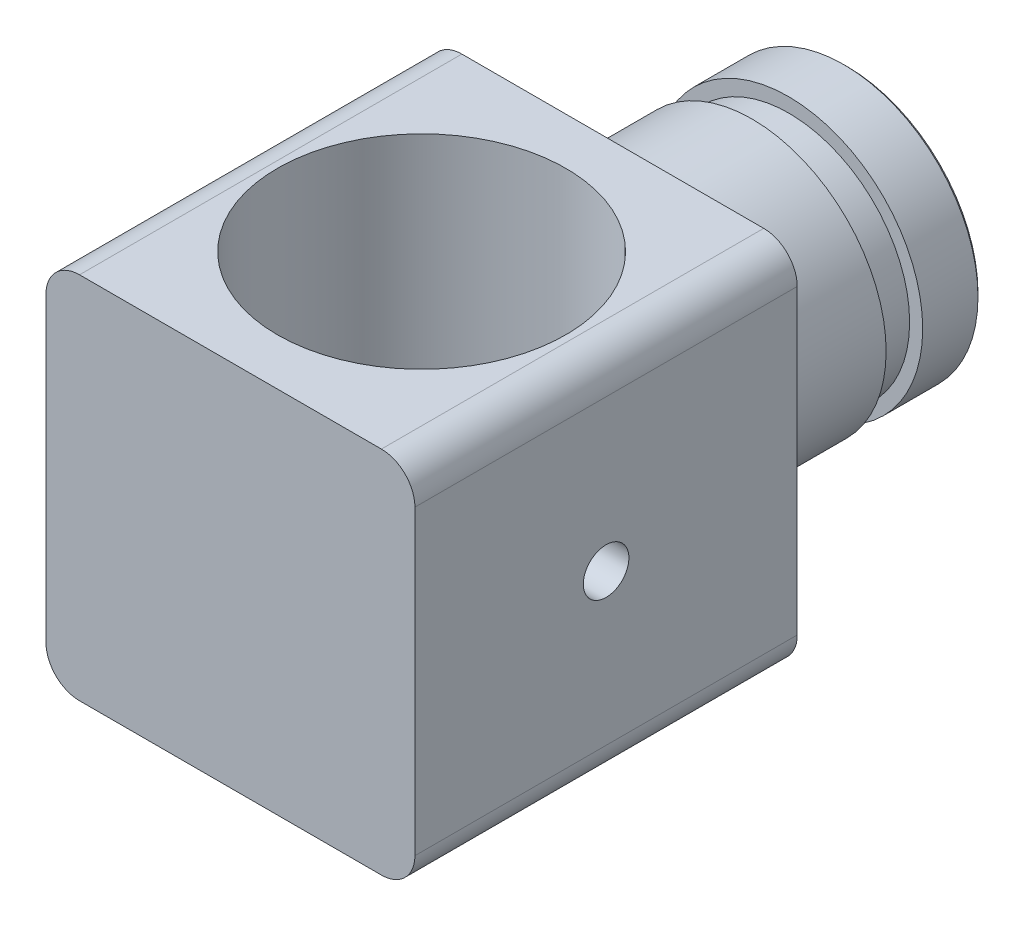
ISO-10303-21;
HEADER;
FILE_DESCRIPTION(('STEP AP214'),'2;1');
FILE_NAME('part.step','',(''),(''),'','','');
FILE_SCHEMA(('AUTOMOTIVE_DESIGN { 1 0 10303 214 1 1 1 1 }'));
ENDSEC;
DATA;
#1=APPLICATION_CONTEXT('core data for automotive mechanical design processes');
#2=APPLICATION_PROTOCOL_DEFINITION('international standard','automotive_design',2000,#1);
#3=PRODUCT_CONTEXT('',#1,'mechanical');
#4=PRODUCT('Part','Part','',(#3));
#5=PRODUCT_RELATED_PRODUCT_CATEGORY('part','',(#4));
#6=PRODUCT_DEFINITION_FORMATION('','',#4);
#7=PRODUCT_DEFINITION_CONTEXT('part definition',#1,'design');
#8=PRODUCT_DEFINITION('design','',#6,#7);
#9=PRODUCT_DEFINITION_SHAPE('','',#8);
#10=(LENGTH_UNIT() NAMED_UNIT(*) SI_UNIT(.MILLI.,.METRE.));
#11=(NAMED_UNIT(*) PLANE_ANGLE_UNIT() SI_UNIT($,.RADIAN.));
#12=(NAMED_UNIT(*) SI_UNIT($,.STERADIAN.) SOLID_ANGLE_UNIT());
#13=UNCERTAINTY_MEASURE_WITH_UNIT(LENGTH_MEASURE(1.E-05),#10,'distance_accuracy_value','');
#14=(GEOMETRIC_REPRESENTATION_CONTEXT(3) GLOBAL_UNCERTAINTY_ASSIGNED_CONTEXT((#13)) GLOBAL_UNIT_ASSIGNED_CONTEXT((#10,
#11,#12)) REPRESENTATION_CONTEXT('',''));
#15=CARTESIAN_POINT('',(0.,0.,0.));
#16=DIRECTION('',(0.,0.,1.));
#17=DIRECTION('',(1.,0.,0.));
#18=AXIS2_PLACEMENT_3D('',#15,#16,#17);
#19=CARTESIAN_POINT('',(27.5,27.5,-37.3403429036413));
#20=DIRECTION('',(0.,0.,1.));
#21=DIRECTION('',(1.,0.,0.));
#22=AXIS2_PLACEMENT_3D('',#19,#20,#21);
#23=PLANE('',#22);
#24=CARTESIAN_POINT('',(27.4461079792746,27.6137274611399,-37.3403429036413));
#25=DIRECTION('',(0.,0.,1.));
#26=DIRECTION('',(1.,0.,0.));
#27=AXIS2_PLACEMENT_3D('',#24,#25,#26);
#28=CIRCLE('',#27,19.5);
#29=CARTESIAN_POINT('',(46.9461079792746,27.6137274611399,-37.3403429036413));
#30=VERTEX_POINT('',#29);
#31=EDGE_CURVE('E12',#30,#30,#28,.F.);
#32=ORIENTED_EDGE('',*,*,#31,.T.);
#33=EDGE_LOOP('',(#32));
#34=FACE_BOUND('',#33,.T.);
#35=ADVANCED_FACE('F45',(#34),#23,.F.);
#36=CARTESIAN_POINT('',(27.4461079792746,27.6137274611399,-32.6853429036413));
#37=DIRECTION('',(0.,0.,-1.));
#38=DIRECTION('',(-1.,0.,0.));
#39=AXIS2_PLACEMENT_3D('',#36,#37,#38);
#40=CYLINDRICAL_SURFACE('',#39,20.);
#41=CARTESIAN_POINT('',(27.4461079792746,27.6137274611399,-36.8403429036413));
#42=DIRECTION('',(0.,0.,1.));
#43=DIRECTION('',(1.,0.,0.));
#44=AXIS2_PLACEMENT_3D('',#41,#42,#43);
#45=CIRCLE('',#44,20.);
#46=CARTESIAN_POINT('',(47.4461079792746,27.6137274611399,-36.8403429036413));
#47=VERTEX_POINT('',#46);
#48=EDGE_CURVE('E55',#47,#47,#45,.T.);
#49=ORIENTED_EDGE('',*,*,#48,.T.);
#50=EDGE_LOOP('',(#49));
#51=FACE_BOUND('',#50,.T.);
#52=CARTESIAN_POINT('',(27.4461079792746,27.6137274611399,-28.5953429036413));
#53=DIRECTION('',(0.,0.,1.));
#54=DIRECTION('',(1.,0.,0.));
#55=AXIS2_PLACEMENT_3D('',#52,#53,#54);
#56=CIRCLE('',#55,20.);
#57=CARTESIAN_POINT('',(47.4461079792746,27.6137274611399,-28.5953429036413));
#58=VERTEX_POINT('',#57);
#59=EDGE_CURVE('E158',#58,#58,#56,.T.);
#60=ORIENTED_EDGE('',*,*,#59,.F.);
#61=EDGE_LOOP('',(#60));
#62=FACE_BOUND('',#61,.T.);
#63=ADVANCED_FACE('F196',(#51,#62),#40,.T.);
#64=CARTESIAN_POINT('',(27.4461079792746,27.6137274611399,-28.5953429036413));
#65=DIRECTION('',(0.,0.,1.));
#66=DIRECTION('',(1.,0.,0.));
#67=AXIS2_PLACEMENT_3D('',#64,#65,#66);
#68=PLANE('',#67);
#69=ORIENTED_EDGE('',*,*,#59,.T.);
#70=EDGE_LOOP('',(#69));
#71=FACE_BOUND('',#70,.T.);
#72=CARTESIAN_POINT('',(27.5,27.5,-28.5953429036413));
#73=DIRECTION('',(0.,0.,1.));
#74=DIRECTION('',(1.,0.,0.));
#75=AXIS2_PLACEMENT_3D('',#72,#73,#74);
#76=CIRCLE('',#75,18.);
#77=CARTESIAN_POINT('',(45.5,27.5,-28.5953429036413));
#78=VERTEX_POINT('',#77);
#79=EDGE_CURVE('E49',#78,#78,#76,.T.);
#80=ORIENTED_EDGE('',*,*,#79,.F.);
#81=EDGE_LOOP('',(#80));
#82=FACE_BOUND('',#81,.T.);
#83=ADVANCED_FACE('F47',(#71,#82),#68,.T.);
#84=CARTESIAN_POINT('',(27.5,27.5,-40.));
#85=DIRECTION('',(0.,0.,1.));
#86=DIRECTION('',(1.,0.,0.));
#87=AXIS2_PLACEMENT_3D('',#84,#85,#86);
#88=CYLINDRICAL_SURFACE('',#87,18.);
#89=CARTESIAN_POINT('',(27.5,27.5,-23.0906858072826));
#90=DIRECTION('',(0.,0.,1.));
#91=DIRECTION('',(1.,0.,0.));
#92=AXIS2_PLACEMENT_3D('',#89,#90,#91);
#93=CIRCLE('',#92,18.);
#94=CARTESIAN_POINT('',(45.5,27.5,-23.0906858072826));
#95=VERTEX_POINT('',#94);
#96=EDGE_CURVE('E156',#95,#95,#93,.F.);
#97=ORIENTED_EDGE('',*,*,#96,.T.);
#98=EDGE_LOOP('',(#97));
#99=FACE_BOUND('',#98,.T.);
#100=ORIENTED_EDGE('',*,*,#79,.T.);
#101=EDGE_LOOP('',(#100));
#102=FACE_BOUND('',#101,.T.);
#103=ADVANCED_FACE('F215',(#99,#102),#88,.T.);
#104=CARTESIAN_POINT('',(27.5,27.5,-23.0906858072826));
#105=DIRECTION('',(0.,0.,1.));
#106=DIRECTION('',(1.,0.,0.));
#107=AXIS2_PLACEMENT_3D('',#104,#105,#106);
#108=PLANE('',#107);
#109=CARTESIAN_POINT('',(27.5,27.5,-23.0906858072826));
#110=DIRECTION('',(0.,0.,1.));
#111=DIRECTION('',(1.,0.,0.));
#112=AXIS2_PLACEMENT_3D('',#109,#110,#111);
#113=CIRCLE('',#112,20.);
#114=CARTESIAN_POINT('',(47.5,27.5,-23.0906858072826));
#115=VERTEX_POINT('',#114);
#116=EDGE_CURVE('E153',#115,#115,#113,.T.);
#117=ORIENTED_EDGE('',*,*,#116,.F.);
#118=EDGE_LOOP('',(#117));
#119=FACE_BOUND('',#118,.T.);
#120=ORIENTED_EDGE('',*,*,#96,.F.);
#121=EDGE_LOOP('',(#120));
#122=FACE_BOUND('',#121,.T.);
#123=ADVANCED_FACE('F212',(#119,#122),#108,.F.);
#124=CARTESIAN_POINT('',(27.5,27.5,-35.));
#125=DIRECTION('',(0.,0.,1.));
#126=DIRECTION('',(1.,0.,0.));
#127=AXIS2_PLACEMENT_3D('',#124,#125,#126);
#128=CYLINDRICAL_SURFACE('',#127,20.);
#129=CARTESIAN_POINT('',(27.5,27.5,-2.3403429036413));
#130=DIRECTION('',(0.,0.,1.));
#131=DIRECTION('',(1.,0.,0.));
#132=AXIS2_PLACEMENT_3D('',#129,#130,#131);
#133=CIRCLE('',#132,20.);
#134=CARTESIAN_POINT('',(47.5,27.5,-2.3403429036413));
#135=VERTEX_POINT('',#134);
#136=EDGE_CURVE('E146',#135,#135,#133,.F.);
#137=ORIENTED_EDGE('',*,*,#136,.T.);
#138=EDGE_LOOP('',(#137));
#139=FACE_BOUND('',#138,.T.);
#140=ORIENTED_EDGE('',*,*,#116,.T.);
#141=EDGE_LOOP('',(#140));
#142=FACE_BOUND('',#141,.T.);
#143=ADVANCED_FACE('F214',(#139,#142),#128,.T.);
#144=CARTESIAN_POINT('',(0.,50.,55.));
#145=DIRECTION('',(1.,0.,0.));
#146=DIRECTION('',(0.,0.,-1.));
#147=AXIS2_PLACEMENT_3D('',#144,#145,#146);
#148=PLANE('',#147);
#149=DIRECTION('',(0.,0.,-1.));
#150=VECTOR('',#149,1.);
#151=CARTESIAN_POINT('',(0.,5.,55.));
#152=LINE('',#151,#150);
#153=CARTESIAN_POINT('',(0.,5.,54.655));
#154=VERTEX_POINT('',#153);
#155=CARTESIAN_POINT('',(0.,5.,-2.3403429036413));
#156=VERTEX_POINT('',#155);
#157=EDGE_CURVE('E130',#154,#156,#152,.T.);
#158=ORIENTED_EDGE('',*,*,#157,.F.);
#159=DIRECTION('',(0.,-1.,0.));
#160=VECTOR('',#159,1.);
#161=CARTESIAN_POINT('',(0.,50.,54.655));
#162=LINE('',#161,#160);
#163=CARTESIAN_POINT('',(0.,50.,54.655));
#164=VERTEX_POINT('',#163);
#165=EDGE_CURVE('E381',#164,#154,#162,.T.);
#166=ORIENTED_EDGE('',*,*,#165,.F.);
#167=DIRECTION('',(0.,0.,-1.));
#168=VECTOR('',#167,1.);
#169=CARTESIAN_POINT('',(0.,50.,55.));
#170=LINE('',#169,#168);
#171=CARTESIAN_POINT('',(0.,50.,-2.3403429036413));
#172=VERTEX_POINT('',#171);
#173=EDGE_CURVE('E398',#172,#164,#170,.F.);
#174=ORIENTED_EDGE('',*,*,#173,.F.);
#175=DIRECTION('',(0.,-1.,0.));
#176=VECTOR('',#175,1.);
#177=CARTESIAN_POINT('',(0.,50.,-2.3403429036413));
#178=LINE('',#177,#176);
#179=EDGE_CURVE('E141',#172,#156,#178,.T.);
#180=ORIENTED_EDGE('',*,*,#179,.T.);
#181=EDGE_LOOP('',(#158,#166,#174,#180));
#182=FACE_BOUND('',#181,.T.);
#183=ADVANCED_FACE('F220',(#182),#148,.F.);
#184=CARTESIAN_POINT('',(55.,5.,55.));
#185=DIRECTION('',(-1.,0.,0.));
#186=DIRECTION('',(0.,0.,1.));
#187=AXIS2_PLACEMENT_3D('',#184,#185,#186);
#188=PLANE('',#187);
#189=CARTESIAN_POINT('',(55.,27.5,26.1573285481794));
#190=DIRECTION('',(1.,0.,0.));
#191=DIRECTION('',(0.,0.,-1.));
#192=AXIS2_PLACEMENT_3D('',#189,#190,#191);
#193=CIRCLE('',#192,3.39999999999999);
#194=CARTESIAN_POINT('',(55.,27.5,22.7573285481794));
#195=VERTEX_POINT('',#194);
#196=EDGE_CURVE('E165',#195,#195,#193,.T.);
#197=ORIENTED_EDGE('',*,*,#196,.F.);
#198=EDGE_LOOP('',(#197));
#199=FACE_BOUND('',#198,.T.);
#200=DIRECTION('',(0.,0.,-1.));
#201=VECTOR('',#200,1.);
#202=CARTESIAN_POINT('',(55.,50.,55.));
#203=LINE('',#202,#201);
#204=CARTESIAN_POINT('',(55.,50.,54.655));
#205=VERTEX_POINT('',#204);
#206=CARTESIAN_POINT('',(55.,50.,-2.3403429036413));
#207=VERTEX_POINT('',#206);
#208=EDGE_CURVE('E119',#205,#207,#203,.T.);
#209=ORIENTED_EDGE('',*,*,#208,.F.);
#210=DIRECTION('',(0.,1.,0.));
#211=VECTOR('',#210,1.);
#212=CARTESIAN_POINT('',(55.,5.,54.655));
#213=LINE('',#212,#211);
#214=CARTESIAN_POINT('',(55.,5.,54.655));
#215=VERTEX_POINT('',#214);
#216=EDGE_CURVE('E129',#215,#205,#213,.T.);
#217=ORIENTED_EDGE('',*,*,#216,.F.);
#218=DIRECTION('',(0.,0.,-1.));
#219=VECTOR('',#218,1.);
#220=CARTESIAN_POINT('',(55.,5.,55.));
#221=LINE('',#220,#219);
#222=CARTESIAN_POINT('',(55.,5.,-2.3403429036413));
#223=VERTEX_POINT('',#222);
#224=EDGE_CURVE('E125',#223,#215,#221,.F.);
#225=ORIENTED_EDGE('',*,*,#224,.F.);
#226=DIRECTION('',(0.,1.,0.));
#227=VECTOR('',#226,1.);
#228=CARTESIAN_POINT('',(55.,5.,-2.3403429036413));
#229=LINE('',#228,#227);
#230=EDGE_CURVE('E127',#223,#207,#229,.T.);
#231=ORIENTED_EDGE('',*,*,#230,.T.);
#232=EDGE_LOOP('',(#209,#217,#225,#231));
#233=FACE_BOUND('',#232,.T.);
#234=ADVANCED_FACE('F126',(#199,#233),#188,.F.);
#235=CARTESIAN_POINT('',(5.,5.,55.));
#236=DIRECTION('',(0.,0.,-1.));
#237=DIRECTION('',(-1.,0.,0.));
#238=AXIS2_PLACEMENT_3D('',#235,#236,#237);
#239=CYLINDRICAL_SURFACE('',#238,5.);
#240=CARTESIAN_POINT('',(5.,5.,54.655));
#241=DIRECTION('',(0.,0.,1.));
#242=DIRECTION('',(1.,0.,0.));
#243=AXIS2_PLACEMENT_3D('',#240,#241,#242);
#244=CIRCLE('',#243,5.);
#245=CARTESIAN_POINT('',(5.,0.,54.655));
#246=VERTEX_POINT('',#245);
#247=EDGE_CURVE('E386',#154,#246,#244,.T.);
#248=ORIENTED_EDGE('',*,*,#247,.F.);
#249=ORIENTED_EDGE('',*,*,#157,.T.);
#250=CARTESIAN_POINT('',(5.,5.,-2.3403429036413));
#251=DIRECTION('',(0.,0.,1.));
#252=DIRECTION('',(1.,0.,0.));
#253=AXIS2_PLACEMENT_3D('',#250,#251,#252);
#254=CIRCLE('',#253,5.);
#255=CARTESIAN_POINT('',(5.,0.,-2.3403429036413));
#256=VERTEX_POINT('',#255);
#257=EDGE_CURVE('E138',#156,#256,#254,.T.);
#258=ORIENTED_EDGE('',*,*,#257,.T.);
#259=DIRECTION('',(0.,0.,1.));
#260=VECTOR('',#259,1.);
#261=CARTESIAN_POINT('',(5.,0.,55.));
#262=LINE('',#261,#260);
#263=EDGE_CURVE('E387',#256,#246,#262,.T.);
#264=ORIENTED_EDGE('',*,*,#263,.T.);
#265=EDGE_LOOP('',(#248,#249,#258,#264));
#266=FACE_BOUND('',#265,.T.);
#267=ADVANCED_FACE('F347',(#266),#239,.T.);
#268=CARTESIAN_POINT('',(50.,5.,55.));
#269=DIRECTION('',(0.,0.,-1.));
#270=DIRECTION('',(-1.,0.,0.));
#271=AXIS2_PLACEMENT_3D('',#268,#269,#270);
#272=CYLINDRICAL_SURFACE('',#271,5.);
#273=CARTESIAN_POINT('',(50.,5.,54.655));
#274=DIRECTION('',(0.,0.,1.));
#275=DIRECTION('',(1.,0.,0.));
#276=AXIS2_PLACEMENT_3D('',#273,#274,#275);
#277=CIRCLE('',#276,5.);
#278=CARTESIAN_POINT('',(50.,0.,54.655));
#279=VERTEX_POINT('',#278);
#280=EDGE_CURVE('E99',#279,#215,#277,.T.);
#281=ORIENTED_EDGE('',*,*,#280,.F.);
#282=DIRECTION('',(0.,0.,1.));
#283=VECTOR('',#282,1.);
#284=CARTESIAN_POINT('',(50.,0.,55.));
#285=LINE('',#284,#283);
#286=CARTESIAN_POINT('',(50.,0.,-2.3403429036413));
#287=VERTEX_POINT('',#286);
#288=EDGE_CURVE('E137',#279,#287,#285,.F.);
#289=ORIENTED_EDGE('',*,*,#288,.T.);
#290=CARTESIAN_POINT('',(50.,5.,-2.3403429036413));
#291=DIRECTION('',(0.,0.,1.));
#292=DIRECTION('',(1.,0.,0.));
#293=AXIS2_PLACEMENT_3D('',#290,#291,#292);
#294=CIRCLE('',#293,5.);
#295=EDGE_CURVE('E90',#287,#223,#294,.T.);
#296=ORIENTED_EDGE('',*,*,#295,.T.);
#297=ORIENTED_EDGE('',*,*,#224,.T.);
#298=EDGE_LOOP('',(#281,#289,#296,#297));
#299=FACE_BOUND('',#298,.T.);
#300=ADVANCED_FACE('F136',(#299),#272,.T.);
#301=CARTESIAN_POINT('',(50.,50.,55.));
#302=DIRECTION('',(0.,0.,-1.));
#303=DIRECTION('',(-1.,0.,0.));
#304=AXIS2_PLACEMENT_3D('',#301,#302,#303);
#305=CYLINDRICAL_SURFACE('',#304,5.);
#306=CARTESIAN_POINT('',(50.,50.,54.655));
#307=DIRECTION('',(0.,0.,1.));
#308=DIRECTION('',(1.,0.,0.));
#309=AXIS2_PLACEMENT_3D('',#306,#307,#308);
#310=CIRCLE('',#309,5.);
#311=CARTESIAN_POINT('',(50.,55.,54.655));
#312=VERTEX_POINT('',#311);
#313=EDGE_CURVE('E392',#205,#312,#310,.T.);
#314=ORIENTED_EDGE('',*,*,#313,.F.);
#315=ORIENTED_EDGE('',*,*,#208,.T.);
#316=CARTESIAN_POINT('',(50.,50.,-2.3403429036413));
#317=DIRECTION('',(0.,0.,1.));
#318=DIRECTION('',(1.,0.,0.));
#319=AXIS2_PLACEMENT_3D('',#316,#317,#318);
#320=CIRCLE('',#319,5.);
#321=CARTESIAN_POINT('',(50.,55.,-2.3403429036413));
#322=VERTEX_POINT('',#321);
#323=EDGE_CURVE('E134',#207,#322,#320,.T.);
#324=ORIENTED_EDGE('',*,*,#323,.T.);
#325=DIRECTION('',(0.,0.,-1.));
#326=VECTOR('',#325,1.);
#327=CARTESIAN_POINT('',(50.,55.,55.));
#328=LINE('',#327,#326);
#329=EDGE_CURVE('E402',#322,#312,#328,.F.);
#330=ORIENTED_EDGE('',*,*,#329,.T.);
#331=EDGE_LOOP('',(#314,#315,#324,#330));
#332=FACE_BOUND('',#331,.T.);
#333=ADVANCED_FACE('F330',(#332),#305,.T.);
#334=CARTESIAN_POINT('',(50.,50.,54.655));
#335=DIRECTION('',(0.,0.,1.));
#336=DIRECTION('',(1.,0.,0.));
#337=AXIS2_PLACEMENT_3D('',#334,#335,#336);
#338=PLANE('',#337);
#339=ORIENTED_EDGE('',*,*,#280,.T.);
#340=ORIENTED_EDGE('',*,*,#216,.T.);
#341=ORIENTED_EDGE('',*,*,#313,.T.);
#342=DIRECTION('',(-1.,0.,0.));
#343=VECTOR('',#342,1.);
#344=CARTESIAN_POINT('',(50.,55.,54.655));
#345=LINE('',#344,#343);
#346=CARTESIAN_POINT('',(5.,55.,54.655));
#347=VERTEX_POINT('',#346);
#348=EDGE_CURVE('E399',#312,#347,#345,.T.);
#349=ORIENTED_EDGE('',*,*,#348,.T.);
#350=CARTESIAN_POINT('',(5.,50.,54.655));
#351=DIRECTION('',(0.,0.,1.));
#352=DIRECTION('',(1.,0.,0.));
#353=AXIS2_PLACEMENT_3D('',#350,#351,#352);
#354=CIRCLE('',#353,5.);
#355=EDGE_CURVE('E149',#164,#347,#354,.F.);
#356=ORIENTED_EDGE('',*,*,#355,.F.);
#357=ORIENTED_EDGE('',*,*,#165,.T.);
#358=ORIENTED_EDGE('',*,*,#247,.T.);
#359=DIRECTION('',(1.,0.,0.));
#360=VECTOR('',#359,1.);
#361=CARTESIAN_POINT('',(5.,0.,54.655));
#362=LINE('',#361,#360);
#363=EDGE_CURVE('E395',#246,#279,#362,.T.);
#364=ORIENTED_EDGE('',*,*,#363,.T.);
#365=EDGE_LOOP('',(#339,#340,#341,#349,#356,#357,#358,#364));
#366=FACE_BOUND('',#365,.T.);
#367=ADVANCED_FACE('F208',(#366),#338,.T.);
#368=CARTESIAN_POINT('',(5.,50.,55.));
#369=DIRECTION('',(0.,0.,-1.));
#370=DIRECTION('',(-1.,0.,0.));
#371=AXIS2_PLACEMENT_3D('',#368,#369,#370);
#372=CYLINDRICAL_SURFACE('',#371,5.);
#373=ORIENTED_EDGE('',*,*,#355,.T.);
#374=DIRECTION('',(0.,0.,-1.));
#375=VECTOR('',#374,1.);
#376=CARTESIAN_POINT('',(5.,55.,55.));
#377=LINE('',#376,#375);
#378=CARTESIAN_POINT('',(5.,55.,-2.3403429036413));
#379=VERTEX_POINT('',#378);
#380=EDGE_CURVE('E176',#347,#379,#377,.T.);
#381=ORIENTED_EDGE('',*,*,#380,.T.);
#382=CARTESIAN_POINT('',(5.,50.,-2.3403429036413));
#383=DIRECTION('',(0.,0.,1.));
#384=DIRECTION('',(1.,0.,0.));
#385=AXIS2_PLACEMENT_3D('',#382,#383,#384);
#386=CIRCLE('',#385,5.);
#387=EDGE_CURVE('E64',#379,#172,#386,.T.);
#388=ORIENTED_EDGE('',*,*,#387,.T.);
#389=ORIENTED_EDGE('',*,*,#173,.T.);
#390=EDGE_LOOP('',(#373,#381,#388,#389));
#391=FACE_BOUND('',#390,.T.);
#392=ADVANCED_FACE('F211',(#391),#372,.T.);
#393=CARTESIAN_POINT('',(50.,50.,-2.3403429036413));
#394=DIRECTION('',(0.,0.,1.));
#395=DIRECTION('',(1.,0.,0.));
#396=AXIS2_PLACEMENT_3D('',#393,#394,#395);
#397=PLANE('',#396);
#398=ORIENTED_EDGE('',*,*,#230,.F.);
#399=ORIENTED_EDGE('',*,*,#295,.F.);
#400=DIRECTION('',(-1.,0.,0.));
#401=VECTOR('',#400,1.);
#402=CARTESIAN_POINT('',(50.,0.,-2.3403429036413));
#403=LINE('',#402,#401);
#404=EDGE_CURVE('E145',#287,#256,#403,.T.);
#405=ORIENTED_EDGE('',*,*,#404,.T.);
#406=ORIENTED_EDGE('',*,*,#257,.F.);
#407=ORIENTED_EDGE('',*,*,#179,.F.);
#408=ORIENTED_EDGE('',*,*,#387,.F.);
#409=DIRECTION('',(1.,0.,0.));
#410=VECTOR('',#409,1.);
#411=CARTESIAN_POINT('',(50.,55.,-2.3403429036413));
#412=LINE('',#411,#410);
#413=EDGE_CURVE('E406',#379,#322,#412,.T.);
#414=ORIENTED_EDGE('',*,*,#413,.T.);
#415=ORIENTED_EDGE('',*,*,#323,.F.);
#416=EDGE_LOOP('',(#398,#399,#405,#406,#407,#408,#414,#415));
#417=FACE_BOUND('',#416,.T.);
#418=ORIENTED_EDGE('',*,*,#136,.F.);
#419=EDGE_LOOP('',(#418));
#420=FACE_BOUND('',#419,.T.);
#421=ADVANCED_FACE('F132',(#417,#420),#397,.F.);
#422=CARTESIAN_POINT('',(5.,0.,55.));
#423=DIRECTION('',(0.,1.,0.));
#424=DIRECTION('',(-1.,0.,0.));
#425=AXIS2_PLACEMENT_3D('',#422,#423,#424);
#426=PLANE('',#425);
#427=ORIENTED_EDGE('',*,*,#288,.F.);
#428=ORIENTED_EDGE('',*,*,#363,.F.);
#429=ORIENTED_EDGE('',*,*,#263,.F.);
#430=ORIENTED_EDGE('',*,*,#404,.F.);
#431=EDGE_LOOP('',(#427,#428,#429,#430));
#432=FACE_BOUND('',#431,.T.);
#433=CARTESIAN_POINT('',(27.5,0.,26.1573285481794));
#434=DIRECTION('',(0.,1.,0.));
#435=DIRECTION('',(0.,0.,1.));
#436=AXIS2_PLACEMENT_3D('',#433,#434,#435);
#437=CIRCLE('',#436,21.5);
#438=CARTESIAN_POINT('',(27.5,0.,47.6573285481794));
#439=VERTEX_POINT('',#438);
#440=EDGE_CURVE('E408',#439,#439,#437,.T.);
#441=ORIENTED_EDGE('',*,*,#440,.T.);
#442=EDGE_LOOP('',(#441));
#443=FACE_BOUND('',#442,.T.);
#444=ADVANCED_FACE('F210',(#432,#443),#426,.F.);
#445=CARTESIAN_POINT('',(50.,55.,55.));
#446=DIRECTION('',(0.,-1.,0.));
#447=DIRECTION('',(0.,0.,-1.));
#448=AXIS2_PLACEMENT_3D('',#445,#446,#447);
#449=PLANE('',#448);
#450=ORIENTED_EDGE('',*,*,#380,.F.);
#451=ORIENTED_EDGE('',*,*,#348,.F.);
#452=ORIENTED_EDGE('',*,*,#329,.F.);
#453=ORIENTED_EDGE('',*,*,#413,.F.);
#454=EDGE_LOOP('',(#450,#451,#452,#453));
#455=FACE_BOUND('',#454,.T.);
#456=CARTESIAN_POINT('',(27.5,55.,26.1573285481794));
#457=DIRECTION('',(0.,1.,0.));
#458=DIRECTION('',(0.,0.,1.));
#459=AXIS2_PLACEMENT_3D('',#456,#457,#458);
#460=CIRCLE('',#459,21.5);
#461=CARTESIAN_POINT('',(27.5,55.,47.6573285481794));
#462=VERTEX_POINT('',#461);
#463=EDGE_CURVE('E151',#462,#462,#460,.F.);
#464=ORIENTED_EDGE('',*,*,#463,.T.);
#465=EDGE_LOOP('',(#464));
#466=FACE_BOUND('',#465,.T.);
#467=ADVANCED_FACE('F193',(#455,#466),#449,.F.);
#468=CARTESIAN_POINT('',(27.5,-196.854825550429,26.1573285481794));
#469=DIRECTION('',(0.,1.,0.));
#470=DIRECTION('',(0.,0.,1.));
#471=AXIS2_PLACEMENT_3D('',#468,#469,#470);
#472=CYLINDRICAL_SURFACE('',#471,21.5);
#473=CARTESIAN_POINT('',(48.729460662014,27.5,22.7573285481794));
#474=CARTESIAN_POINT('',(48.7294639618692,27.6896939521722,22.7573362866255));
#475=CARTESIAN_POINT('',(48.732030683631,27.8794949205934,22.7732574733332));
#476=CARTESIAN_POINT('',(48.7420121513576,28.253781269295,22.8364995360654));
#477=CARTESIAN_POINT('',(48.7494315032716,28.4382614253741,22.8838502445413));
#478=CARTESIAN_POINT('',(48.7682573673925,28.7964347287215,23.0084916043445));
#479=CARTESIAN_POINT('',(48.7796606896157,28.9701363757421,23.0857583071341));
#480=CARTESIAN_POINT('',(48.8051658498743,29.3020878497866,23.2679803519209));
#481=CARTESIAN_POINT('',(48.8192673487009,29.4603396153627,23.3729322140278));
#482=CARTESIAN_POINT('',(48.8487200295239,29.7583271031328,23.6085407170449));
#483=CARTESIAN_POINT('',(48.8640802548019,29.8979056300952,23.7393950671887));
#484=CARTESIAN_POINT('',(48.8942391480654,30.1532207927524,24.0226669603452));
#485=CARTESIAN_POINT('',(48.9090377840076,30.2689560696611,24.1750857314428));
#486=CARTESIAN_POINT('',(48.9365012459787,30.4738842950748,24.4981725206969));
#487=CARTESIAN_POINT('',(48.9491542165638,30.5629317357341,24.6689339256123));
#488=CARTESIAN_POINT('',(48.970800308926,30.7110220781307,25.0232236870184));
#489=CARTESIAN_POINT('',(48.9797936452202,30.7700667385946,25.2067512944527));
#490=CARTESIAN_POINT('',(48.99304334423,30.8559968579283,25.5797422708036));
#491=CARTESIAN_POINT('',(48.9973385260682,30.8831459983227,25.7691434910803));
#492=CARTESIAN_POINT('',(49.0008411679586,30.9053337282957,26.1498584500936));
#493=CARTESIAN_POINT('',(49.0000489408234,30.9003742921537,26.3411720705191));
#494=CARTESIAN_POINT('',(48.9934969070068,30.8586925697387,26.7184803071083));
#495=CARTESIAN_POINT('',(48.9877814748244,30.8222540068788,26.9045071469043));
#496=CARTESIAN_POINT('',(48.972074660327,30.7190944127977,27.267772314894));
#497=CARTESIAN_POINT('',(48.9620831581698,30.6523725328454,27.4450103966162));
#498=CARTESIAN_POINT('',(48.9388709039729,30.4902538845927,27.786518539651));
#499=CARTESIAN_POINT('',(48.9256368797089,30.3947388810455,27.9507315342044));
#500=CARTESIAN_POINT('',(48.8974123305725,30.177831768997,28.2609059766671));
#501=CARTESIAN_POINT('',(48.8824216774571,30.0564377706621,28.4068660904102));
#502=CARTESIAN_POINT('',(48.8521601180761,29.7896413048822,28.678065820054));
#503=CARTESIAN_POINT('',(48.8368879393554,29.643990992562,28.8030615969963));
#504=CARTESIAN_POINT('',(48.807943734522,29.3336551035732,29.026877136224));
#505=CARTESIAN_POINT('',(48.7942717204638,29.1689693835223,29.1256967013213));
#506=CARTESIAN_POINT('',(48.770075702559,28.8249697437213,29.2943947388945));
#507=CARTESIAN_POINT('',(48.7595546493444,28.6456423118301,29.3642461082843));
#508=CARTESIAN_POINT('',(48.7429023221267,28.2775967642155,29.4727688023485));
#509=CARTESIAN_POINT('',(48.7367707023135,28.0888793895073,29.5114425832979));
#510=CARTESIAN_POINT('',(48.7296577209192,27.7095862391902,29.5561736326443));
#511=CARTESIAN_POINT('',(48.728621636348,27.5190523282319,29.5625774792298));
#512=CARTESIAN_POINT('',(48.731671525112,27.1396336414322,29.5435083867505));
#513=CARTESIAN_POINT('',(48.7357573211047,26.9507488087205,29.5180365513642));
#514=CARTESIAN_POINT('',(48.7485401979052,26.5810766615272,29.4362338348605));
#515=CARTESIAN_POINT('',(48.7572112022187,26.4002497637321,29.3800774002696));
#516=CARTESIAN_POINT('',(48.7781658098128,26.050574386276,29.2386817325699));
#517=CARTESIAN_POINT('',(48.7904496096108,25.8817265588347,29.1534409173808));
#518=CARTESIAN_POINT('',(48.8173738169985,25.5592539749565,28.9554704806939));
#519=CARTESIAN_POINT('',(48.8320330202751,25.4057678895846,28.8425175801658));
#520=CARTESIAN_POINT('',(48.8620004888643,25.1198050782807,28.5926378058753));
#521=CARTESIAN_POINT('',(48.8773087950701,24.9873296785138,28.4557094199604));
#522=CARTESIAN_POINT('',(48.9070216264751,24.7458941187018,28.1602348647969));
#523=CARTESIAN_POINT('',(48.9214164121474,24.6371643343608,28.0014993270846));
#524=CARTESIAN_POINT('',(48.9475266541176,24.4479155812137,27.6678142934326));
#525=CARTESIAN_POINT('',(48.9592421902241,24.3673957720594,27.4928652806732));
#526=CARTESIAN_POINT('',(48.9786314005791,24.2372161739839,27.13242208896));
#527=CARTESIAN_POINT('',(48.9863212155463,24.1874330032638,26.9469733764481));
#528=CARTESIAN_POINT('',(48.9968605376302,24.1197414632532,26.5702170372193));
#529=CARTESIAN_POINT('',(48.9997104016919,24.1018307433738,26.3789098436232));
#530=CARTESIAN_POINT('',(49.0002444447086,24.0984547859379,25.9980962385157));
#531=CARTESIAN_POINT('',(48.9979845939312,24.1126380024316,25.8085929290302));
#532=CARTESIAN_POINT('',(48.9886666466457,24.1722905253061,25.4347028265944));
#533=CARTESIAN_POINT('',(48.9816085707269,24.2177596974388,25.2503160116928));
#534=CARTESIAN_POINT('',(48.9634838941937,24.3385638000639,24.8920075114173));
#535=CARTESIAN_POINT('',(48.9524209177966,24.413871733903,24.7180765294957));
#536=CARTESIAN_POINT('',(48.9274980055041,24.5921774110063,24.385264147209));
#537=CARTESIAN_POINT('',(48.9136379586886,24.6951762524297,24.2263833440382));
#538=CARTESIAN_POINT('',(48.8844793230305,24.9271994089113,23.9264039443349));
#539=CARTESIAN_POINT('',(48.869167317785,25.05648230759,23.7855066369001));
#540=CARTESIAN_POINT('',(48.8389267110169,25.336859950563,23.5272803641909));
#541=CARTESIAN_POINT('',(48.8239982001872,25.4879597994454,23.409956929985));
#542=CARTESIAN_POINT('',(48.7961136498197,25.8088071811984,23.201537292478));
#543=CARTESIAN_POINT('',(48.7831706276526,25.9786661840648,23.1106109553573));
#544=CARTESIAN_POINT('',(48.7608756451299,26.3313759185497,22.9587177567905));
#545=CARTESIAN_POINT('',(48.7515200262053,26.5142131876383,22.8977203548388));
#546=CARTESIAN_POINT('',(48.7395795848919,26.8315174113472,22.8209774666403));
#547=CARTESIAN_POINT('',(48.7358055702601,26.9640422785997,22.7971464784909));
#548=CARTESIAN_POINT('',(48.7307449578791,27.2310268465268,22.7653193967385));
#549=CARTESIAN_POINT('',(48.7294583220606,27.3654865175574,22.7573230607859));
#550=CARTESIAN_POINT('',(48.729460662014,27.5,22.7573285481794));
#551=B_SPLINE_CURVE_WITH_KNOTS('',3,(#473,#474,#475,#476,#477,#478,#479,#480,#481,#482,#483,
#484,#485,#486,#487,#488,#489,#490,#491,#492,#493,#494,#495,#496,#497,#498,#499,#500,#501,#502,
#503,#504,#505,#506,#507,#508,#509,#510,#511,#512,#513,#514,#515,#516,#517,#518,#519,#520,#521,
#522,#523,#524,#525,#526,#527,#528,#529,#530,#531,#532,#533,#534,#535,#536,#537,#538,#539,#540,
#541,#542,#543,#544,#545,#546,#547,#548,#549,#550),.UNSPECIFIED.,.T.,.F.,(4,2,2,2,2,2,2,2,2,2,2,
2,2,2,2,2,2,2,2,2,2,2,2,2,2,2,2,2,2,2,2,2,2,2,2,2,2,2,4),(0.,0.568590087383569,1.13772064557615,
1.70639653871095,2.27500098607683,2.84812558951634,3.42128284531707,3.99751048979082,
4.57370435260132,5.14510050885685,5.71646153166525,6.2827259390693,6.8490062177843,
7.41764428409016,7.98632388986113,8.56121742293424,9.1361152866191,9.71154982659326,
10.2869390274714,10.8561351927505,11.4253116504595,11.991285422448,12.5572899861764,
13.1280139718659,13.6987739665343,14.2748469980059,14.8509028673528,15.42463106045,
15.998316939419,16.5657493172074,17.1331792601556,17.7000969882297,18.2670372023052,
18.8398512619848,19.4127995628082,19.9893569841811,20.5653248367469,20.9685227376858,
21.3717144676301),.UNSPECIFIED.);
#552=CARTESIAN_POINT('',(48.729460662014,27.5,22.7573285481794));
#553=VERTEX_POINT('',#552);
#554=EDGE_CURVE('E160',#553,#553,#551,.T.);
#555=ORIENTED_EDGE('',*,*,#554,.T.);
#556=EDGE_LOOP('',(#555));
#557=FACE_BOUND('',#556,.T.);
#558=ORIENTED_EDGE('',*,*,#463,.F.);
#559=EDGE_LOOP('',(#558));
#560=FACE_BOUND('',#559,.T.);
#561=ORIENTED_EDGE('',*,*,#440,.F.);
#562=EDGE_LOOP('',(#561));
#563=FACE_BOUND('',#562,.T.);
#564=ADVANCED_FACE('F184',(#557,#560,#563),#472,.F.);
#565=CARTESIAN_POINT('',(55.,27.5,26.1573285481794));
#566=DIRECTION('',(1.,0.,0.));
#567=DIRECTION('',(0.,0.,-1.));
#568=AXIS2_PLACEMENT_3D('',#565,#566,#567);
#569=CYLINDRICAL_SURFACE('',#568,3.39999999999999);
#570=ORIENTED_EDGE('',*,*,#554,.F.);
#571=EDGE_LOOP('',(#570));
#572=FACE_BOUND('',#571,.T.);
#573=ORIENTED_EDGE('',*,*,#196,.T.);
#574=EDGE_LOOP('',(#573));
#575=FACE_BOUND('',#574,.T.);
#576=ADVANCED_FACE('F180',(#572,#575),#569,.F.);
#577=CARTESIAN_POINT('',(27.4461079792746,27.6137274611399,-36.8403429036413));
#578=DIRECTION('',(0.,0.,1.));
#579=DIRECTION('',(1.,0.,0.));
#580=AXIS2_PLACEMENT_3D('',#577,#578,#579);
#581=CONICAL_SURFACE('',#580,20.,0.785398163397445);
#582=ORIENTED_EDGE('',*,*,#31,.F.);
#583=EDGE_LOOP('',(#582));
#584=FACE_BOUND('',#583,.T.);
#585=ORIENTED_EDGE('',*,*,#48,.F.);
#586=EDGE_LOOP('',(#585));
#587=FACE_BOUND('',#586,.T.);
#588=ADVANCED_FACE('F183',(#584,#587),#581,.T.);
#589=CLOSED_SHELL('',(#35,#63,#83,#103,#123,#143,#183,#234,#267,#300,#333,#367,#392,#421,#444,
#467,#564,#576,#588));
#590=MANIFOLD_SOLID_BREP('B2',#589);
#591=ADVANCED_BREP_SHAPE_REPRESENTATION('',(#18,#590),#14);
#592=SHAPE_DEFINITION_REPRESENTATION(#9,#591);
ENDSEC;
END-ISO-10303-21;
